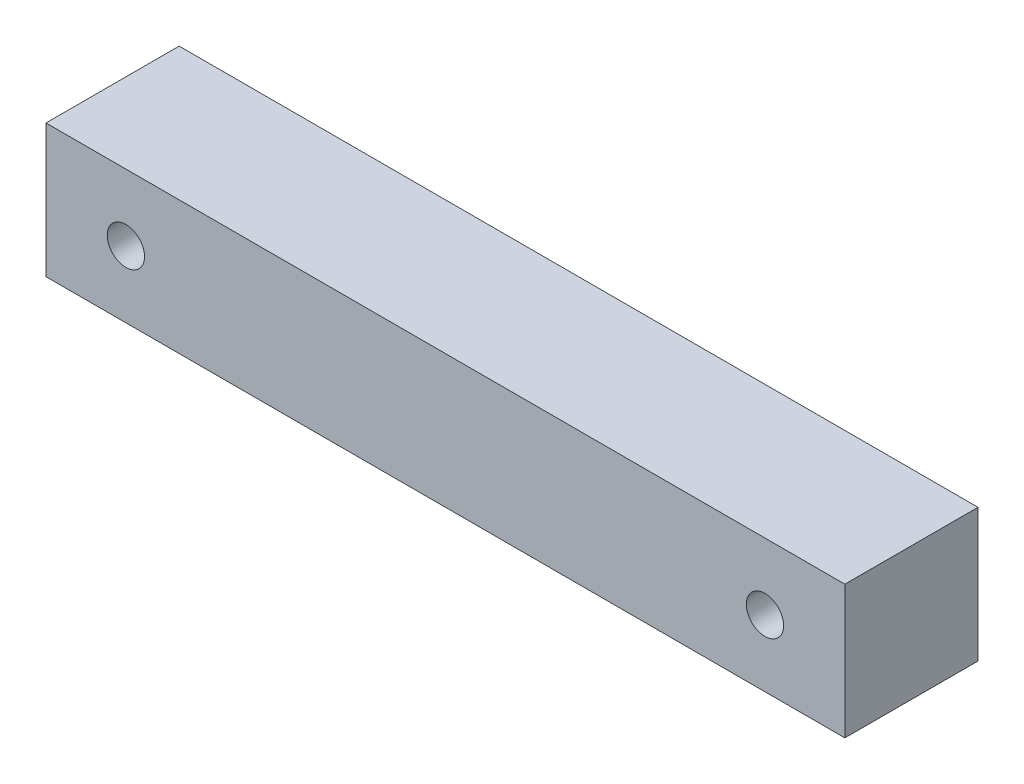
ISO-10303-21;
HEADER;
FILE_DESCRIPTION(('STEP AP214'),'2;1');
FILE_NAME('part.step','',(''),(''),'','','');
FILE_SCHEMA(('AUTOMOTIVE_DESIGN { 1 0 10303 214 1 1 1 1 }'));
ENDSEC;
DATA;
#1=APPLICATION_CONTEXT('core data for automotive mechanical design processes');
#2=APPLICATION_PROTOCOL_DEFINITION('international standard','automotive_design',2000,#1);
#3=PRODUCT_CONTEXT('',#1,'mechanical');
#4=PRODUCT('Part','Part','',(#3));
#5=PRODUCT_RELATED_PRODUCT_CATEGORY('part','',(#4));
#6=PRODUCT_DEFINITION_FORMATION('','',#4);
#7=PRODUCT_DEFINITION_CONTEXT('part definition',#1,'design');
#8=PRODUCT_DEFINITION('design','',#6,#7);
#9=PRODUCT_DEFINITION_SHAPE('','',#8);
#10=(LENGTH_UNIT() NAMED_UNIT(*) SI_UNIT(.MILLI.,.METRE.));
#11=(NAMED_UNIT(*) PLANE_ANGLE_UNIT() SI_UNIT($,.RADIAN.));
#12=(NAMED_UNIT(*) SI_UNIT($,.STERADIAN.) SOLID_ANGLE_UNIT());
#13=UNCERTAINTY_MEASURE_WITH_UNIT(LENGTH_MEASURE(1.E-05),#10,'distance_accuracy_value','');
#14=(GEOMETRIC_REPRESENTATION_CONTEXT(3) GLOBAL_UNCERTAINTY_ASSIGNED_CONTEXT((#13)) GLOBAL_UNIT_ASSIGNED_CONTEXT((#10,
#11,#12)) REPRESENTATION_CONTEXT('',''));
#15=CARTESIAN_POINT('',(0.,0.,0.));
#16=DIRECTION('',(0.,0.,1.));
#17=DIRECTION('',(1.,0.,0.));
#18=AXIS2_PLACEMENT_3D('',#15,#16,#17);
#19=CARTESIAN_POINT('',(0.,10.,0.));
#20=DIRECTION('',(1.,0.,0.));
#21=DIRECTION('',(0.,0.,-1.));
#22=AXIS2_PLACEMENT_3D('',#19,#20,#21);
#23=PLANE('',#22);
#24=DIRECTION('',(0.,0.,1.));
#25=VECTOR('',#24,1.);
#26=CARTESIAN_POINT('',(0.,0.,0.));
#27=LINE('',#26,#25);
#28=CARTESIAN_POINT('',(0.,0.,-10.));
#29=VERTEX_POINT('',#28);
#30=CARTESIAN_POINT('',(0.,0.,0.));
#31=VERTEX_POINT('',#30);
#32=EDGE_CURVE('E101',#29,#31,#27,.T.);
#33=ORIENTED_EDGE('',*,*,#32,.T.);
#34=DIRECTION('',(0.,-1.,0.));
#35=VECTOR('',#34,1.);
#36=CARTESIAN_POINT('',(0.,10.,0.));
#37=LINE('',#36,#35);
#38=CARTESIAN_POINT('',(0.,10.,0.));
#39=VERTEX_POINT('',#38);
#40=EDGE_CURVE('E11',#39,#31,#37,.T.);
#41=ORIENTED_EDGE('',*,*,#40,.F.);
#42=DIRECTION('',(0.,0.,1.));
#43=VECTOR('',#42,1.);
#44=CARTESIAN_POINT('',(0.,10.,0.));
#45=LINE('',#44,#43);
#46=CARTESIAN_POINT('',(0.,10.,-10.));
#47=VERTEX_POINT('',#46);
#48=EDGE_CURVE('E88',#47,#39,#45,.T.);
#49=ORIENTED_EDGE('',*,*,#48,.F.);
#50=DIRECTION('',(0.,-1.,0.));
#51=VECTOR('',#50,1.);
#52=CARTESIAN_POINT('',(0.,10.,-10.));
#53=LINE('',#52,#51);
#54=EDGE_CURVE('E97',#47,#29,#53,.T.);
#55=ORIENTED_EDGE('',*,*,#54,.T.);
#56=EDGE_LOOP('',(#33,#41,#49,#55));
#57=FACE_BOUND('',#56,.T.);
#58=ADVANCED_FACE('F35',(#57),#23,.F.);
#59=CARTESIAN_POINT('',(0.,10.,0.));
#60=DIRECTION('',(0.,0.,-1.));
#61=DIRECTION('',(-1.,0.,0.));
#62=AXIS2_PLACEMENT_3D('',#59,#60,#61);
#63=PLANE('',#62);
#64=CARTESIAN_POINT('',(6.,5.,0.));
#65=DIRECTION('',(0.,0.,1.));
#66=DIRECTION('',(1.,0.,0.));
#67=AXIS2_PLACEMENT_3D('',#64,#65,#66);
#68=CIRCLE('',#67,1.4);
#69=CARTESIAN_POINT('',(7.4,5.,0.));
#70=VERTEX_POINT('',#69);
#71=EDGE_CURVE('E110',#70,#70,#68,.T.);
#72=ORIENTED_EDGE('',*,*,#71,.F.);
#73=EDGE_LOOP('',(#72));
#74=FACE_BOUND('',#73,.T.);
#75=CARTESIAN_POINT('',(54.,5.,0.));
#76=DIRECTION('',(0.,0.,1.));
#77=DIRECTION('',(1.,0.,0.));
#78=AXIS2_PLACEMENT_3D('',#75,#76,#77);
#79=CIRCLE('',#78,1.4);
#80=CARTESIAN_POINT('',(55.4,5.,0.));
#81=VERTEX_POINT('',#80);
#82=EDGE_CURVE('E115',#81,#81,#79,.T.);
#83=ORIENTED_EDGE('',*,*,#82,.F.);
#84=EDGE_LOOP('',(#83));
#85=FACE_BOUND('',#84,.T.);
#86=DIRECTION('',(1.,0.,0.));
#87=VECTOR('',#86,1.);
#88=CARTESIAN_POINT('',(0.,0.,0.));
#89=LINE('',#88,#87);
#90=CARTESIAN_POINT('',(60.,0.,0.));
#91=VERTEX_POINT('',#90);
#92=EDGE_CURVE('E92',#31,#91,#89,.T.);
#93=ORIENTED_EDGE('',*,*,#92,.T.);
#94=DIRECTION('',(0.,-1.,0.));
#95=VECTOR('',#94,1.);
#96=CARTESIAN_POINT('',(60.,10.,0.));
#97=LINE('',#96,#95);
#98=CARTESIAN_POINT('',(60.,10.,0.));
#99=VERTEX_POINT('',#98);
#100=EDGE_CURVE('E44',#99,#91,#97,.T.);
#101=ORIENTED_EDGE('',*,*,#100,.F.);
#102=DIRECTION('',(1.,0.,0.));
#103=VECTOR('',#102,1.);
#104=CARTESIAN_POINT('',(0.,10.,0.));
#105=LINE('',#104,#103);
#106=EDGE_CURVE('E83',#39,#99,#105,.T.);
#107=ORIENTED_EDGE('',*,*,#106,.F.);
#108=ORIENTED_EDGE('',*,*,#40,.T.);
#109=EDGE_LOOP('',(#93,#101,#107,#108));
#110=FACE_BOUND('',#109,.T.);
#111=ADVANCED_FACE('F91',(#74,#85,#110),#63,.F.);
#112=CARTESIAN_POINT('',(60.,10.,0.));
#113=DIRECTION('',(-1.,0.,0.));
#114=DIRECTION('',(0.,0.,1.));
#115=AXIS2_PLACEMENT_3D('',#112,#113,#114);
#116=PLANE('',#115);
#117=DIRECTION('',(0.,0.,-1.));
#118=VECTOR('',#117,1.);
#119=CARTESIAN_POINT('',(60.,0.,0.));
#120=LINE('',#119,#118);
#121=CARTESIAN_POINT('',(60.,0.,-10.));
#122=VERTEX_POINT('',#121);
#123=EDGE_CURVE('E70',#91,#122,#120,.T.);
#124=ORIENTED_EDGE('',*,*,#123,.T.);
#125=DIRECTION('',(0.,-1.,0.));
#126=VECTOR('',#125,1.);
#127=CARTESIAN_POINT('',(60.,10.,-10.));
#128=LINE('',#127,#126);
#129=CARTESIAN_POINT('',(60.,10.,-10.));
#130=VERTEX_POINT('',#129);
#131=EDGE_CURVE('E93',#130,#122,#128,.T.);
#132=ORIENTED_EDGE('',*,*,#131,.F.);
#133=DIRECTION('',(0.,0.,-1.));
#134=VECTOR('',#133,1.);
#135=CARTESIAN_POINT('',(60.,10.,0.));
#136=LINE('',#135,#134);
#137=EDGE_CURVE('E86',#99,#130,#136,.T.);
#138=ORIENTED_EDGE('',*,*,#137,.F.);
#139=ORIENTED_EDGE('',*,*,#100,.T.);
#140=EDGE_LOOP('',(#124,#132,#138,#139));
#141=FACE_BOUND('',#140,.T.);
#142=ADVANCED_FACE('F95',(#141),#116,.F.);
#143=CARTESIAN_POINT('',(0.,10.,-10.));
#144=DIRECTION('',(0.,0.,1.));
#145=DIRECTION('',(1.,0.,0.));
#146=AXIS2_PLACEMENT_3D('',#143,#144,#145);
#147=PLANE('',#146);
#148=CARTESIAN_POINT('',(6.,5.,-10.));
#149=DIRECTION('',(0.,0.,1.));
#150=DIRECTION('',(1.,0.,0.));
#151=AXIS2_PLACEMENT_3D('',#148,#149,#150);
#152=CIRCLE('',#151,1.4);
#153=CARTESIAN_POINT('',(7.4,5.,-10.));
#154=VERTEX_POINT('',#153);
#155=EDGE_CURVE('E38',#154,#154,#152,.T.);
#156=ORIENTED_EDGE('',*,*,#155,.T.);
#157=EDGE_LOOP('',(#156));
#158=FACE_BOUND('',#157,.T.);
#159=CARTESIAN_POINT('',(54.,5.,-10.));
#160=DIRECTION('',(0.,0.,1.));
#161=DIRECTION('',(1.,0.,0.));
#162=AXIS2_PLACEMENT_3D('',#159,#160,#161);
#163=CIRCLE('',#162,1.4);
#164=CARTESIAN_POINT('',(55.4,5.,-10.));
#165=VERTEX_POINT('',#164);
#166=EDGE_CURVE('E108',#165,#165,#163,.T.);
#167=ORIENTED_EDGE('',*,*,#166,.T.);
#168=EDGE_LOOP('',(#167));
#169=FACE_BOUND('',#168,.T.);
#170=DIRECTION('',(-1.,0.,0.));
#171=VECTOR('',#170,1.);
#172=CARTESIAN_POINT('',(0.,0.,-10.));
#173=LINE('',#172,#171);
#174=EDGE_CURVE('E76',#122,#29,#173,.T.);
#175=ORIENTED_EDGE('',*,*,#174,.T.);
#176=ORIENTED_EDGE('',*,*,#54,.F.);
#177=DIRECTION('',(-1.,0.,0.));
#178=VECTOR('',#177,1.);
#179=CARTESIAN_POINT('',(0.,10.,-10.));
#180=LINE('',#179,#178);
#181=EDGE_CURVE('E53',#130,#47,#180,.T.);
#182=ORIENTED_EDGE('',*,*,#181,.F.);
#183=ORIENTED_EDGE('',*,*,#131,.T.);
#184=EDGE_LOOP('',(#175,#176,#182,#183));
#185=FACE_BOUND('',#184,.T.);
#186=ADVANCED_FACE('F132',(#158,#169,#185),#147,.F.);
#187=CARTESIAN_POINT('',(0.,10.,0.));
#188=DIRECTION('',(0.,-1.,0.));
#189=DIRECTION('',(0.,0.,-1.));
#190=AXIS2_PLACEMENT_3D('',#187,#188,#189);
#191=PLANE('',#190);
#192=ORIENTED_EDGE('',*,*,#48,.T.);
#193=ORIENTED_EDGE('',*,*,#106,.T.);
#194=ORIENTED_EDGE('',*,*,#137,.T.);
#195=ORIENTED_EDGE('',*,*,#181,.T.);
#196=EDGE_LOOP('',(#192,#193,#194,#195));
#197=FACE_BOUND('',#196,.T.);
#198=ADVANCED_FACE('F84',(#197),#191,.F.);
#199=CARTESIAN_POINT('',(0.,0.,0.));
#200=DIRECTION('',(0.,-1.,0.));
#201=DIRECTION('',(0.,0.,-1.));
#202=AXIS2_PLACEMENT_3D('',#199,#200,#201);
#203=PLANE('',#202);
#204=ORIENTED_EDGE('',*,*,#32,.F.);
#205=ORIENTED_EDGE('',*,*,#174,.F.);
#206=ORIENTED_EDGE('',*,*,#123,.F.);
#207=ORIENTED_EDGE('',*,*,#92,.F.);
#208=EDGE_LOOP('',(#204,#205,#206,#207));
#209=FACE_BOUND('',#208,.T.);
#210=ADVANCED_FACE('F139',(#209),#203,.T.);
#211=CARTESIAN_POINT('',(54.,5.,-20.));
#212=DIRECTION('',(0.,0.,1.));
#213=DIRECTION('',(1.,0.,0.));
#214=AXIS2_PLACEMENT_3D('',#211,#212,#213);
#215=CYLINDRICAL_SURFACE('',#214,1.4);
#216=ORIENTED_EDGE('',*,*,#82,.T.);
#217=EDGE_LOOP('',(#216));
#218=FACE_BOUND('',#217,.T.);
#219=ORIENTED_EDGE('',*,*,#166,.F.);
#220=EDGE_LOOP('',(#219));
#221=FACE_BOUND('',#220,.T.);
#222=ADVANCED_FACE('F123',(#218,#221),#215,.F.);
#223=CARTESIAN_POINT('',(6.,5.,-20.));
#224=DIRECTION('',(0.,0.,1.));
#225=DIRECTION('',(1.,0.,0.));
#226=AXIS2_PLACEMENT_3D('',#223,#224,#225);
#227=CYLINDRICAL_SURFACE('',#226,1.4);
#228=ORIENTED_EDGE('',*,*,#71,.T.);
#229=EDGE_LOOP('',(#228));
#230=FACE_BOUND('',#229,.T.);
#231=ORIENTED_EDGE('',*,*,#155,.F.);
#232=EDGE_LOOP('',(#231));
#233=FACE_BOUND('',#232,.T.);
#234=ADVANCED_FACE('F147',(#230,#233),#227,.F.);
#235=CLOSED_SHELL('',(#58,#111,#142,#186,#198,#210,#222,#234));
#236=MANIFOLD_SOLID_BREP('B2',#235);
#237=ADVANCED_BREP_SHAPE_REPRESENTATION('',(#18,#236),#14);
#238=SHAPE_DEFINITION_REPRESENTATION(#9,#237);
ENDSEC;
END-ISO-10303-21;
